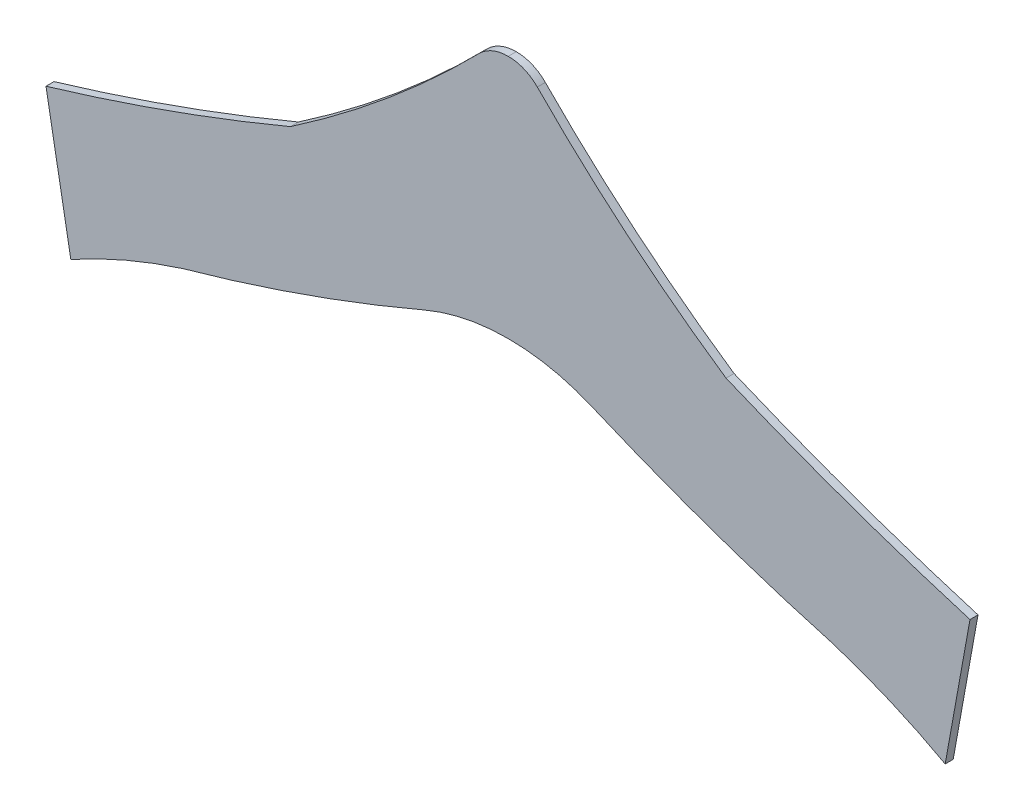
ISO-10303-21;
HEADER;
FILE_DESCRIPTION(('STEP AP214'),'2;1');
FILE_NAME('part.step','',(''),(''),'','','');
FILE_SCHEMA(('AUTOMOTIVE_DESIGN { 1 0 10303 214 1 1 1 1 }'));
ENDSEC;
DATA;
#1=APPLICATION_CONTEXT('core data for automotive mechanical design processes');
#2=APPLICATION_PROTOCOL_DEFINITION('international standard','automotive_design',2000,#1);
#3=PRODUCT_CONTEXT('',#1,'mechanical');
#4=PRODUCT('Part','Part','',(#3));
#5=PRODUCT_RELATED_PRODUCT_CATEGORY('part','',(#4));
#6=PRODUCT_DEFINITION_FORMATION('','',#4);
#7=PRODUCT_DEFINITION_CONTEXT('part definition',#1,'design');
#8=PRODUCT_DEFINITION('design','',#6,#7);
#9=PRODUCT_DEFINITION_SHAPE('','',#8);
#10=(LENGTH_UNIT() NAMED_UNIT(*) SI_UNIT(.MILLI.,.METRE.));
#11=(NAMED_UNIT(*) PLANE_ANGLE_UNIT() SI_UNIT($,.RADIAN.));
#12=(NAMED_UNIT(*) SI_UNIT($,.STERADIAN.) SOLID_ANGLE_UNIT());
#13=UNCERTAINTY_MEASURE_WITH_UNIT(LENGTH_MEASURE(1.E-05),#10,'distance_accuracy_value','');
#14=(GEOMETRIC_REPRESENTATION_CONTEXT(3) GLOBAL_UNCERTAINTY_ASSIGNED_CONTEXT((#13)) GLOBAL_UNIT_ASSIGNED_CONTEXT((#10,
#11,#12)) REPRESENTATION_CONTEXT('',''));
#15=CARTESIAN_POINT('',(0.,0.,0.));
#16=DIRECTION('',(0.,0.,1.));
#17=DIRECTION('',(1.,0.,0.));
#18=AXIS2_PLACEMENT_3D('',#15,#16,#17);
#19=CARTESIAN_POINT('',(-281.954590354069,-637.701637012419,0.));
#20=DIRECTION('',(0.984127859750687,0.177460856705166,0.));
#21=DIRECTION('',(-0.177460856705166,0.984127859750688,0.));
#22=AXIS2_PLACEMENT_3D('',#19,#20,#21);
#23=PLANE('',#22);
#24=DIRECTION('',(0.,0.,-1.));
#25=VECTOR('',#24,1.);
#26=CARTESIAN_POINT('',(-346.348412368071,-280.598919171426,6.35));
#27=LINE('',#26,#25);
#28=CARTESIAN_POINT('',(-346.348412368071,-280.598919171426,0.));
#29=VERTEX_POINT('',#28);
#30=CARTESIAN_POINT('',(-346.348412368071,-280.598919171426,6.35));
#31=VERTEX_POINT('',#30);
#32=EDGE_CURVE('E183',#29,#31,#27,.F.);
#33=ORIENTED_EDGE('',*,*,#32,.T.);
#34=DIRECTION('',(-0.177460856705166,0.984127859750688,0.));
#35=VECTOR('',#34,1.);
#36=CARTESIAN_POINT('',(-128.661609224621,-1487.80399893421,6.35));
#37=LINE('',#36,#35);
#38=CARTESIAN_POINT('',(-366.008450633972,-171.572107622879,6.35));
#39=VERTEX_POINT('',#38);
#40=EDGE_CURVE('E41',#31,#39,#37,.T.);
#41=ORIENTED_EDGE('',*,*,#40,.T.);
#42=DIRECTION('',(0.,0.,-1.));
#43=VECTOR('',#42,1.);
#44=CARTESIAN_POINT('',(-366.008450633972,-171.572107622879,6.35));
#45=LINE('',#44,#43);
#46=CARTESIAN_POINT('',(-366.008450633972,-171.572107622879,0.));
#47=VERTEX_POINT('',#46);
#48=EDGE_CURVE('E187',#39,#47,#45,.T.);
#49=ORIENTED_EDGE('',*,*,#48,.T.);
#50=DIRECTION('',(-0.177460856705166,0.984127859750688,0.));
#51=VECTOR('',#50,1.);
#52=CARTESIAN_POINT('',(-128.661609224621,-1487.80399893421,0.));
#53=LINE('',#52,#51);
#54=EDGE_CURVE('E182',#29,#47,#53,.T.);
#55=ORIENTED_EDGE('',*,*,#54,.F.);
#56=EDGE_LOOP('',(#33,#41,#49,#55));
#57=FACE_BOUND('',#56,.T.);
#58=ADVANCED_FACE('F38',(#57),#23,.F.);
#59=CARTESIAN_POINT('',(281.954590354069,-637.701637012419,0.));
#60=DIRECTION('',(-0.984127859750687,0.177460856705166,0.));
#61=DIRECTION('',(0.177460856705166,0.984127859750688,0.));
#62=AXIS2_PLACEMENT_3D('',#59,#60,#61);
#63=PLANE('',#62);
#64=DIRECTION('',(0.,0.,-1.));
#65=VECTOR('',#64,1.);
#66=CARTESIAN_POINT('',(346.38431386247,-280.399823655375,6.35));
#67=LINE('',#66,#65);
#68=CARTESIAN_POINT('',(346.38431386247,-280.399823655375,6.35));
#69=VERTEX_POINT('',#68);
#70=CARTESIAN_POINT('',(346.38431386247,-280.399823655375,0.));
#71=VERTEX_POINT('',#70);
#72=EDGE_CURVE('E179',#69,#71,#67,.T.);
#73=ORIENTED_EDGE('',*,*,#72,.T.);
#74=DIRECTION('',(-0.177460856705166,-0.984127859750688,0.));
#75=VECTOR('',#74,1.);
#76=CARTESIAN_POINT('',(124.848478327971,-1508.95011767804,0.));
#77=LINE('',#76,#75);
#78=CARTESIAN_POINT('',(366.028712193128,-171.459745013918,0.));
#79=VERTEX_POINT('',#78);
#80=EDGE_CURVE('E195',#79,#71,#77,.T.);
#81=ORIENTED_EDGE('',*,*,#80,.F.);
#82=DIRECTION('',(0.,0.,-1.));
#83=VECTOR('',#82,1.);
#84=CARTESIAN_POINT('',(366.028712193128,-171.459745013918,6.35));
#85=LINE('',#84,#83);
#86=CARTESIAN_POINT('',(366.028712193128,-171.459745013918,6.35));
#87=VERTEX_POINT('',#86);
#88=EDGE_CURVE('E184',#79,#87,#85,.F.);
#89=ORIENTED_EDGE('',*,*,#88,.T.);
#90=DIRECTION('',(-0.177460856705166,-0.984127859750688,0.));
#91=VECTOR('',#90,1.);
#92=CARTESIAN_POINT('',(124.848478327971,-1508.95011767804,6.35));
#93=LINE('',#92,#91);
#94=EDGE_CURVE('E200',#87,#69,#93,.T.);
#95=ORIENTED_EDGE('',*,*,#94,.T.);
#96=EDGE_LOOP('',(#73,#81,#89,#95));
#97=FACE_BOUND('',#96,.T.);
#98=ADVANCED_FACE('F281',(#97),#63,.F.);
#99=CARTESIAN_POINT('',(-672.379989115381,1243.44690256662,6.35));
#100=DIRECTION('',(0.,0.,-1.));
#101=DIRECTION('',(-1.,0.,0.));
#102=AXIS2_PLACEMENT_3D('',#99,#100,#101);
#103=CYLINDRICAL_SURFACE('',#102,1542.75273348375);
#104=CARTESIAN_POINT('',(-672.379989115381,1243.44690256662,0.));
#105=DIRECTION('',(0.,0.,1.));
#106=DIRECTION('',(1.,0.,0.));
#107=AXIS2_PLACEMENT_3D('',#104,#105,#106);
#108=CIRCLE('',#107,1542.75273348375);
#109=CARTESIAN_POINT('',(-257.390281985946,-242.443248032747,0.));
#110=VERTEX_POINT('',#109);
#111=CARTESIAN_POINT('',(-65.9980683442758,-175.139352418789,0.));
#112=VERTEX_POINT('',#111);
#113=EDGE_CURVE('E248',#110,#112,#108,.T.);
#114=ORIENTED_EDGE('',*,*,#113,.T.);
#115=DIRECTION('',(0.,0.,-1.));
#116=VECTOR('',#115,1.);
#117=CARTESIAN_POINT('',(-65.9980683442758,-175.139352418789,6.35));
#118=LINE('',#117,#116);
#119=CARTESIAN_POINT('',(-65.9980683442758,-175.139352418789,6.35));
#120=VERTEX_POINT('',#119);
#121=EDGE_CURVE('E243',#120,#112,#118,.T.);
#122=ORIENTED_EDGE('',*,*,#121,.F.);
#123=CARTESIAN_POINT('',(-672.379989115381,1243.44690256662,6.35));
#124=DIRECTION('',(0.,0.,1.));
#125=DIRECTION('',(1.,0.,0.));
#126=AXIS2_PLACEMENT_3D('',#123,#124,#125);
#127=CIRCLE('',#126,1542.75273348375);
#128=CARTESIAN_POINT('',(-257.390281985946,-242.443248032747,6.35));
#129=VERTEX_POINT('',#128);
#130=EDGE_CURVE('E157',#129,#120,#127,.T.);
#131=ORIENTED_EDGE('',*,*,#130,.F.);
#132=DIRECTION('',(0.,0.,-1.));
#133=VECTOR('',#132,1.);
#134=CARTESIAN_POINT('',(-257.390281985946,-242.443248032747,6.35));
#135=LINE('',#134,#133);
#136=EDGE_CURVE('E241',#129,#110,#135,.T.);
#137=ORIENTED_EDGE('',*,*,#136,.T.);
#138=EDGE_LOOP('',(#114,#122,#131,#137));
#139=FACE_BOUND('',#138,.T.);
#140=ADVANCED_FACE('F262',(#139),#103,.T.);
#141=CARTESIAN_POINT('',(-0.103357156905126,-329.29522080043,6.35));
#142=DIRECTION('',(0.,0.,-1.));
#143=DIRECTION('',(-1.,0.,0.));
#144=AXIS2_PLACEMENT_3D('',#141,#142,#143);
#145=CYLINDRICAL_SURFACE('',#144,167.648873300624);
#146=CARTESIAN_POINT('',(-0.103357156905126,-329.29522080043,0.));
#147=DIRECTION('',(0.,0.,1.));
#148=DIRECTION('',(1.,0.,0.));
#149=AXIS2_PLACEMENT_3D('',#146,#147,#148);
#150=CIRCLE('',#149,167.648873300624);
#151=CARTESIAN_POINT('',(0.198935808298546,-161.646620037013,0.));
#152=VERTEX_POINT('',#151);
#153=EDGE_CURVE('E190',#152,#112,#150,.T.);
#154=ORIENTED_EDGE('',*,*,#153,.F.);
#155=DIRECTION('',(0.,0.,-1.));
#156=VECTOR('',#155,1.);
#157=CARTESIAN_POINT('',(0.198935808298546,-161.646620037013,6.35));
#158=LINE('',#157,#156);
#159=CARTESIAN_POINT('',(0.198935808298546,-161.646620037013,6.35));
#160=VERTEX_POINT('',#159);
#161=EDGE_CURVE('E101',#160,#152,#158,.T.);
#162=ORIENTED_EDGE('',*,*,#161,.F.);
#163=CARTESIAN_POINT('',(-0.103357156905126,-329.29522080043,6.35));
#164=DIRECTION('',(0.,0.,1.));
#165=DIRECTION('',(1.,0.,0.));
#166=AXIS2_PLACEMENT_3D('',#163,#164,#165);
#167=CIRCLE('',#166,167.648873300624);
#168=EDGE_CURVE('E154',#160,#120,#167,.T.);
#169=ORIENTED_EDGE('',*,*,#168,.T.);
#170=ORIENTED_EDGE('',*,*,#121,.T.);
#171=EDGE_LOOP('',(#154,#162,#169,#170));
#172=FACE_BOUND('',#171,.T.);
#173=ADVANCED_FACE('F257',(#172),#145,.F.);
#174=CARTESIAN_POINT('',(0.50122877370562,-329.295220800431,6.35));
#175=DIRECTION('',(0.,0.,-1.));
#176=DIRECTION('',(-1.,0.,0.));
#177=AXIS2_PLACEMENT_3D('',#174,#175,#176);
#178=CYLINDRICAL_SURFACE('',#177,167.648873300624);
#179=CARTESIAN_POINT('',(0.50122877370562,-329.295220800431,0.));
#180=DIRECTION('',(0.,0.,1.));
#181=DIRECTION('',(1.,0.,0.));
#182=AXIS2_PLACEMENT_3D('',#179,#180,#181);
#183=CIRCLE('',#182,167.648873300624);
#184=CARTESIAN_POINT('',(66.3959399610755,-175.139352418789,0.));
#185=VERTEX_POINT('',#184);
#186=EDGE_CURVE('E204',#185,#152,#183,.T.);
#187=ORIENTED_EDGE('',*,*,#186,.F.);
#188=DIRECTION('',(0.,0.,-1.));
#189=VECTOR('',#188,1.);
#190=CARTESIAN_POINT('',(66.3959399610755,-175.139352418789,6.35));
#191=LINE('',#190,#189);
#192=CARTESIAN_POINT('',(66.3959399610755,-175.139352418789,6.35));
#193=VERTEX_POINT('',#192);
#194=EDGE_CURVE('E199',#193,#185,#191,.T.);
#195=ORIENTED_EDGE('',*,*,#194,.F.);
#196=CARTESIAN_POINT('',(0.50122877370562,-329.295220800431,6.35));
#197=DIRECTION('',(0.,0.,1.));
#198=DIRECTION('',(1.,0.,0.));
#199=AXIS2_PLACEMENT_3D('',#196,#197,#198);
#200=CIRCLE('',#199,167.648873300624);
#201=EDGE_CURVE('E167',#193,#160,#200,.T.);
#202=ORIENTED_EDGE('',*,*,#201,.T.);
#203=ORIENTED_EDGE('',*,*,#161,.T.);
#204=EDGE_LOOP('',(#187,#195,#202,#203));
#205=FACE_BOUND('',#204,.T.);
#206=ADVANCED_FACE('F321',(#205),#178,.F.);
#207=CARTESIAN_POINT('',(672.777860732181,1243.44690256662,6.35));
#208=DIRECTION('',(0.,0.,-1.));
#209=DIRECTION('',(-1.,0.,0.));
#210=AXIS2_PLACEMENT_3D('',#207,#208,#209);
#211=CYLINDRICAL_SURFACE('',#210,1542.75273348375);
#212=CARTESIAN_POINT('',(672.777860732181,1243.44690256662,0.));
#213=DIRECTION('',(0.,0.,1.));
#214=DIRECTION('',(1.,0.,0.));
#215=AXIS2_PLACEMENT_3D('',#212,#213,#214);
#216=CIRCLE('',#215,1542.75273348375);
#217=CARTESIAN_POINT('',(257.788153605722,-242.443248033578,0.));
#218=VERTEX_POINT('',#217);
#219=EDGE_CURVE('E192',#185,#218,#216,.T.);
#220=ORIENTED_EDGE('',*,*,#219,.T.);
#221=DIRECTION('',(0.,0.,-1.));
#222=VECTOR('',#221,1.);
#223=CARTESIAN_POINT('',(257.788153605722,-242.443248033578,6.35));
#224=LINE('',#223,#222);
#225=CARTESIAN_POINT('',(257.788153605722,-242.443248033578,6.35));
#226=VERTEX_POINT('',#225);
#227=EDGE_CURVE('E238',#226,#218,#224,.T.);
#228=ORIENTED_EDGE('',*,*,#227,.F.);
#229=CARTESIAN_POINT('',(672.777860732181,1243.44690256662,6.35));
#230=DIRECTION('',(0.,0.,1.));
#231=DIRECTION('',(1.,0.,0.));
#232=AXIS2_PLACEMENT_3D('',#229,#230,#231);
#233=CIRCLE('',#232,1542.75273348375);
#234=EDGE_CURVE('E164',#193,#226,#233,.T.);
#235=ORIENTED_EDGE('',*,*,#234,.F.);
#236=ORIENTED_EDGE('',*,*,#194,.T.);
#237=EDGE_LOOP('',(#220,#228,#235,#236));
#238=FACE_BOUND('',#237,.T.);
#239=ADVANCED_FACE('F292',(#238),#211,.T.);
#240=CARTESIAN_POINT('',(108.423517049824,-713.458443864965,6.35));
#241=DIRECTION('',(0.,0.,-1.));
#242=DIRECTION('',(-1.,0.,0.));
#243=AXIS2_PLACEMENT_3D('',#240,#241,#242);
#244=CYLINDRICAL_SURFACE('',#243,494.130660207949);
#245=ORIENTED_EDGE('',*,*,#72,.F.);
#246=CARTESIAN_POINT('',(108.423517049824,-713.458443864965,6.35));
#247=DIRECTION('',(0.,0.,1.));
#248=DIRECTION('',(1.,0.,0.));
#249=AXIS2_PLACEMENT_3D('',#246,#247,#248);
#250=CIRCLE('',#249,494.130660207949);
#251=EDGE_CURVE('E163',#69,#226,#250,.T.);
#252=ORIENTED_EDGE('',*,*,#251,.T.);
#253=ORIENTED_EDGE('',*,*,#227,.T.);
#254=CARTESIAN_POINT('',(108.423517049824,-713.458443864965,0.));
#255=DIRECTION('',(0.,0.,1.));
#256=DIRECTION('',(1.,0.,0.));
#257=AXIS2_PLACEMENT_3D('',#254,#255,#256);
#258=CIRCLE('',#257,494.130660207949);
#259=EDGE_CURVE('E191',#71,#218,#258,.T.);
#260=ORIENTED_EDGE('',*,*,#259,.F.);
#261=EDGE_LOOP('',(#245,#252,#253,#260));
#262=FACE_BOUND('',#261,.T.);
#263=ADVANCED_FACE('F285',(#262),#244,.F.);
#264=CARTESIAN_POINT('',(913.079353349683,1666.28875354813,6.35));
#265=DIRECTION('',(0.,0.,-1.));
#266=DIRECTION('',(-1.,0.,0.));
#267=AXIS2_PLACEMENT_3D('',#264,#265,#266);
#268=CYLINDRICAL_SURFACE('',#267,1917.44203248934);
#269=ORIENTED_EDGE('',*,*,#88,.F.);
#270=CARTESIAN_POINT('',(913.079353349683,1666.28875354813,0.));
#271=DIRECTION('',(0.,0.,1.));
#272=DIRECTION('',(1.,0.,0.));
#273=AXIS2_PLACEMENT_3D('',#270,#271,#272);
#274=CIRCLE('',#273,1917.44203248934);
#275=CARTESIAN_POINT('',(172.780430357107,-102.479589840254,0.));
#276=VERTEX_POINT('',#275);
#277=EDGE_CURVE('E11',#276,#79,#274,.T.);
#278=ORIENTED_EDGE('',*,*,#277,.F.);
#279=DIRECTION('',(0.,0.,-1.));
#280=VECTOR('',#279,1.);
#281=CARTESIAN_POINT('',(172.780430357107,-102.479589840254,6.35));
#282=LINE('',#281,#280);
#283=CARTESIAN_POINT('',(172.780430357107,-102.479589840254,6.35));
#284=VERTEX_POINT('',#283);
#285=EDGE_CURVE('E56',#284,#276,#282,.T.);
#286=ORIENTED_EDGE('',*,*,#285,.F.);
#287=CARTESIAN_POINT('',(913.079353349683,1666.28875354813,6.35));
#288=DIRECTION('',(0.,0.,1.));
#289=DIRECTION('',(1.,0.,0.));
#290=AXIS2_PLACEMENT_3D('',#287,#288,#289);
#291=CIRCLE('',#290,1917.44203248934);
#292=EDGE_CURVE('E178',#284,#87,#291,.T.);
#293=ORIENTED_EDGE('',*,*,#292,.T.);
#294=EDGE_LOOP('',(#269,#278,#286,#293));
#295=FACE_BOUND('',#294,.T.);
#296=ADVANCED_FACE('F282',(#295),#268,.F.);
#297=CARTESIAN_POINT('',(728.015078309155,713.887936740855,6.35));
#298=DIRECTION('',(0.,0.,-1.));
#299=DIRECTION('',(-1.,0.,0.));
#300=AXIS2_PLACEMENT_3D('',#297,#298,#299);
#301=CYLINDRICAL_SURFACE('',#300,987.289953733245);
#302=CARTESIAN_POINT('',(728.015078309155,713.887936740855,0.));
#303=DIRECTION('',(0.,0.,1.));
#304=DIRECTION('',(1.,0.,0.));
#305=AXIS2_PLACEMENT_3D('',#302,#303,#304);
#306=CIRCLE('',#305,987.289953733245);
#307=CARTESIAN_POINT('',(23.2459862804848,22.4821371819585,0.));
#308=VERTEX_POINT('',#307);
#309=EDGE_CURVE('E47',#308,#276,#306,.T.);
#310=ORIENTED_EDGE('',*,*,#309,.F.);
#311=DIRECTION('',(0.,0.,-1.));
#312=VECTOR('',#311,1.);
#313=CARTESIAN_POINT('',(23.2459862804848,22.4821371819585,6.35));
#314=LINE('',#313,#312);
#315=CARTESIAN_POINT('',(23.2459862804848,22.4821371819585,6.35));
#316=VERTEX_POINT('',#315);
#317=EDGE_CURVE('E89',#316,#308,#314,.T.);
#318=ORIENTED_EDGE('',*,*,#317,.F.);
#319=CARTESIAN_POINT('',(728.015078309155,713.887936740855,6.35));
#320=DIRECTION('',(0.,0.,1.));
#321=DIRECTION('',(1.,0.,0.));
#322=AXIS2_PLACEMENT_3D('',#319,#320,#321);
#323=CIRCLE('',#322,987.289953733245);
#324=EDGE_CURVE('E176',#316,#284,#323,.T.);
#325=ORIENTED_EDGE('',*,*,#324,.T.);
#326=ORIENTED_EDGE('',*,*,#285,.T.);
#327=EDGE_LOOP('',(#310,#318,#325,#326));
#328=FACE_BOUND('',#327,.T.);
#329=ADVANCED_FACE('F284',(#328),#301,.F.);
#330=CARTESIAN_POINT('',(0.397871616618417,8.88178419700125E-13,6.35));
#331=DIRECTION('',(0.,0.,-1.));
#332=DIRECTION('',(-1.,0.,0.));
#333=AXIS2_PLACEMENT_3D('',#330,#331,#332);
#334=CYLINDRICAL_SURFACE('',#333,32.0543731175878);
#335=CARTESIAN_POINT('',(0.397871616618417,8.88178419700125E-13,0.));
#336=DIRECTION('',(0.,0.,1.));
#337=DIRECTION('',(1.,0.,0.));
#338=AXIS2_PLACEMENT_3D('',#335,#336,#337);
#339=CIRCLE('',#338,32.0543731175878);
#340=CARTESIAN_POINT('',(0.198935808334844,32.0537557940486,0.));
#341=VERTEX_POINT('',#340);
#342=EDGE_CURVE('E126',#308,#341,#339,.T.);
#343=ORIENTED_EDGE('',*,*,#342,.T.);
#344=DIRECTION('',(0.,0.,-1.));
#345=VECTOR('',#344,1.);
#346=CARTESIAN_POINT('',(0.198935808334844,32.0537557940486,6.35));
#347=LINE('',#346,#345);
#348=CARTESIAN_POINT('',(0.198935808334844,32.0537557940486,6.35));
#349=VERTEX_POINT('',#348);
#350=EDGE_CURVE('E129',#349,#341,#347,.T.);
#351=ORIENTED_EDGE('',*,*,#350,.F.);
#352=CARTESIAN_POINT('',(0.397871616618417,8.88178419700125E-13,6.35));
#353=DIRECTION('',(0.,0.,1.));
#354=DIRECTION('',(1.,0.,0.));
#355=AXIS2_PLACEMENT_3D('',#352,#353,#354);
#356=CIRCLE('',#355,32.0543731175878);
#357=EDGE_CURVE('E174',#316,#349,#356,.T.);
#358=ORIENTED_EDGE('',*,*,#357,.F.);
#359=ORIENTED_EDGE('',*,*,#317,.T.);
#360=EDGE_LOOP('',(#343,#351,#358,#359));
#361=FACE_BOUND('',#360,.T.);
#362=ADVANCED_FACE('F128',(#361),#334,.T.);
#363=CARTESIAN_POINT('',(0.,0.,6.35));
#364=DIRECTION('',(0.,0.,-1.));
#365=DIRECTION('',(-1.,0.,0.));
#366=AXIS2_PLACEMENT_3D('',#363,#364,#365);
#367=CYLINDRICAL_SURFACE('',#366,32.0543731175692);
#368=CARTESIAN_POINT('',(0.,0.,0.));
#369=DIRECTION('',(0.,0.,1.));
#370=DIRECTION('',(1.,0.,0.));
#371=AXIS2_PLACEMENT_3D('',#368,#369,#370);
#372=CIRCLE('',#371,32.0543731175692);
#373=CARTESIAN_POINT('',(-22.8481146638402,22.4821371819298,0.));
#374=VERTEX_POINT('',#373);
#375=EDGE_CURVE('E134',#341,#374,#372,.T.);
#376=ORIENTED_EDGE('',*,*,#375,.T.);
#377=DIRECTION('',(0.,0.,-1.));
#378=VECTOR('',#377,1.);
#379=CARTESIAN_POINT('',(-22.8481146638402,22.4821371819298,6.35));
#380=LINE('',#379,#378);
#381=CARTESIAN_POINT('',(-22.8481146638402,22.4821371819298,6.35));
#382=VERTEX_POINT('',#381);
#383=EDGE_CURVE('E142',#382,#374,#380,.T.);
#384=ORIENTED_EDGE('',*,*,#383,.F.);
#385=CARTESIAN_POINT('',(0.,0.,6.35));
#386=DIRECTION('',(0.,0.,1.));
#387=DIRECTION('',(1.,0.,0.));
#388=AXIS2_PLACEMENT_3D('',#385,#386,#387);
#389=CIRCLE('',#388,32.0543731175692);
#390=EDGE_CURVE('E141',#349,#382,#389,.T.);
#391=ORIENTED_EDGE('',*,*,#390,.F.);
#392=ORIENTED_EDGE('',*,*,#350,.T.);
#393=EDGE_LOOP('',(#376,#384,#391,#392));
#394=FACE_BOUND('',#393,.T.);
#395=ADVANCED_FACE('F138',(#394),#367,.T.);
#396=CARTESIAN_POINT('',(-727.617206692508,713.887936740829,6.35));
#397=DIRECTION('',(0.,0.,-1.));
#398=DIRECTION('',(-1.,0.,0.));
#399=AXIS2_PLACEMENT_3D('',#396,#397,#398);
#400=CYLINDRICAL_SURFACE('',#399,987.289953733245);
#401=CARTESIAN_POINT('',(-727.617206692508,713.887936740829,0.));
#402=DIRECTION('',(0.,0.,1.));
#403=DIRECTION('',(1.,0.,0.));
#404=AXIS2_PLACEMENT_3D('',#401,#402,#403);
#405=CIRCLE('',#404,987.289953733245);
#406=CARTESIAN_POINT('',(-172.382558738814,-102.479589839161,0.));
#407=VERTEX_POINT('',#406);
#408=EDGE_CURVE('E147',#407,#374,#405,.T.);
#409=ORIENTED_EDGE('',*,*,#408,.F.);
#410=DIRECTION('',(0.,0.,-1.));
#411=VECTOR('',#410,1.);
#412=CARTESIAN_POINT('',(-172.382558738814,-102.479589839161,6.35));
#413=LINE('',#412,#411);
#414=CARTESIAN_POINT('',(-172.382558738814,-102.479589839161,6.35));
#415=VERTEX_POINT('',#414);
#416=EDGE_CURVE('E158',#415,#407,#413,.T.);
#417=ORIENTED_EDGE('',*,*,#416,.F.);
#418=CARTESIAN_POINT('',(-727.617206692508,713.887936740829,6.35));
#419=DIRECTION('',(0.,0.,1.));
#420=DIRECTION('',(1.,0.,0.));
#421=AXIS2_PLACEMENT_3D('',#418,#419,#420);
#422=CIRCLE('',#421,987.289953733245);
#423=EDGE_CURVE('E170',#415,#382,#422,.T.);
#424=ORIENTED_EDGE('',*,*,#423,.T.);
#425=ORIENTED_EDGE('',*,*,#383,.T.);
#426=EDGE_LOOP('',(#409,#417,#424,#425));
#427=FACE_BOUND('',#426,.T.);
#428=ADVANCED_FACE('F233',(#427),#400,.F.);
#429=CARTESIAN_POINT('',(-912.681481733131,1666.28875354833,6.35));
#430=DIRECTION('',(0.,0.,-1.));
#431=DIRECTION('',(-1.,0.,0.));
#432=AXIS2_PLACEMENT_3D('',#429,#430,#431);
#433=CYLINDRICAL_SURFACE('',#432,1917.44203248915);
#434=ORIENTED_EDGE('',*,*,#48,.F.);
#435=CARTESIAN_POINT('',(-912.681481733131,1666.28875354833,6.35));
#436=DIRECTION('',(0.,0.,1.));
#437=DIRECTION('',(1.,0.,0.));
#438=AXIS2_PLACEMENT_3D('',#435,#436,#437);
#439=CIRCLE('',#438,1917.44203248915);
#440=EDGE_CURVE('E169',#39,#415,#439,.T.);
#441=ORIENTED_EDGE('',*,*,#440,.T.);
#442=ORIENTED_EDGE('',*,*,#416,.T.);
#443=CARTESIAN_POINT('',(-912.681481733131,1666.28875354833,0.));
#444=DIRECTION('',(0.,0.,1.));
#445=DIRECTION('',(1.,0.,0.));
#446=AXIS2_PLACEMENT_3D('',#443,#444,#445);
#447=CIRCLE('',#446,1917.44203248915);
#448=EDGE_CURVE('E149',#47,#407,#447,.T.);
#449=ORIENTED_EDGE('',*,*,#448,.F.);
#450=EDGE_LOOP('',(#434,#441,#442,#449));
#451=FACE_BOUND('',#450,.T.);
#452=ADVANCED_FACE('F231',(#451),#433,.F.);
#453=CARTESIAN_POINT('',(-108.025645433023,-713.458443864964,6.35));
#454=DIRECTION('',(0.,0.,-1.));
#455=DIRECTION('',(-1.,0.,0.));
#456=AXIS2_PLACEMENT_3D('',#453,#454,#455);
#457=CYLINDRICAL_SURFACE('',#456,494.130660207897);
#458=ORIENTED_EDGE('',*,*,#32,.F.);
#459=CARTESIAN_POINT('',(-108.025645433023,-713.458443864964,0.));
#460=DIRECTION('',(0.,0.,1.));
#461=DIRECTION('',(1.,0.,0.));
#462=AXIS2_PLACEMENT_3D('',#459,#460,#461);
#463=CIRCLE('',#462,494.130660207897);
#464=EDGE_CURVE('E193',#110,#29,#463,.T.);
#465=ORIENTED_EDGE('',*,*,#464,.F.);
#466=ORIENTED_EDGE('',*,*,#136,.F.);
#467=CARTESIAN_POINT('',(-108.025645433023,-713.458443864964,6.35));
#468=DIRECTION('',(0.,0.,1.));
#469=DIRECTION('',(1.,0.,0.));
#470=AXIS2_PLACEMENT_3D('',#467,#468,#469);
#471=CIRCLE('',#470,494.130660207897);
#472=EDGE_CURVE('E160',#129,#31,#471,.T.);
#473=ORIENTED_EDGE('',*,*,#472,.T.);
#474=EDGE_LOOP('',(#458,#465,#466,#473));
#475=FACE_BOUND('',#474,.T.);
#476=ADVANCED_FACE('F266',(#475),#457,.F.);
#477=CARTESIAN_POINT('',(-60.5405790775166,-1475.52021258494,0.));
#478=DIRECTION('',(0.,0.,1.));
#479=DIRECTION('',(1.,0.,0.));
#480=AXIS2_PLACEMENT_3D('',#477,#478,#479);
#481=PLANE('',#480);
#482=ORIENTED_EDGE('',*,*,#464,.T.);
#483=ORIENTED_EDGE('',*,*,#54,.T.);
#484=ORIENTED_EDGE('',*,*,#448,.T.);
#485=ORIENTED_EDGE('',*,*,#408,.T.);
#486=ORIENTED_EDGE('',*,*,#375,.F.);
#487=ORIENTED_EDGE('',*,*,#342,.F.);
#488=ORIENTED_EDGE('',*,*,#309,.T.);
#489=ORIENTED_EDGE('',*,*,#277,.T.);
#490=ORIENTED_EDGE('',*,*,#80,.T.);
#491=ORIENTED_EDGE('',*,*,#259,.T.);
#492=ORIENTED_EDGE('',*,*,#219,.F.);
#493=ORIENTED_EDGE('',*,*,#186,.T.);
#494=ORIENTED_EDGE('',*,*,#153,.T.);
#495=ORIENTED_EDGE('',*,*,#113,.F.);
#496=EDGE_LOOP('',(#482,#483,#484,#485,#486,#487,#488,#489,#490,#491,#492,#493,#494,#495));
#497=FACE_BOUND('',#496,.T.);
#498=ADVANCED_FACE('F145',(#497),#481,.F.);
#499=CARTESIAN_POINT('',(-60.5405790775166,-1475.52021258494,6.35));
#500=DIRECTION('',(0.,0.,1.));
#501=DIRECTION('',(1.,0.,0.));
#502=AXIS2_PLACEMENT_3D('',#499,#500,#501);
#503=PLANE('',#502);
#504=ORIENTED_EDGE('',*,*,#40,.F.);
#505=ORIENTED_EDGE('',*,*,#472,.F.);
#506=ORIENTED_EDGE('',*,*,#130,.T.);
#507=ORIENTED_EDGE('',*,*,#168,.F.);
#508=ORIENTED_EDGE('',*,*,#201,.F.);
#509=ORIENTED_EDGE('',*,*,#234,.T.);
#510=ORIENTED_EDGE('',*,*,#251,.F.);
#511=ORIENTED_EDGE('',*,*,#94,.F.);
#512=ORIENTED_EDGE('',*,*,#292,.F.);
#513=ORIENTED_EDGE('',*,*,#324,.F.);
#514=ORIENTED_EDGE('',*,*,#357,.T.);
#515=ORIENTED_EDGE('',*,*,#390,.T.);
#516=ORIENTED_EDGE('',*,*,#423,.F.);
#517=ORIENTED_EDGE('',*,*,#440,.F.);
#518=EDGE_LOOP('',(#504,#505,#506,#507,#508,#509,#510,#511,#512,#513,#514,#515,#516,#517));
#519=FACE_BOUND('',#518,.T.);
#520=ADVANCED_FACE('F227',(#519),#503,.T.);
#521=CLOSED_SHELL('',(#58,#98,#140,#173,#206,#239,#263,#296,#329,#362,#395,#428,#452,#476,#498,#520));
#522=MANIFOLD_SOLID_BREP('B2',#521);
#523=ADVANCED_BREP_SHAPE_REPRESENTATION('',(#18,#522),#14);
#524=SHAPE_DEFINITION_REPRESENTATION(#9,#523);
ENDSEC;
END-ISO-10303-21;
